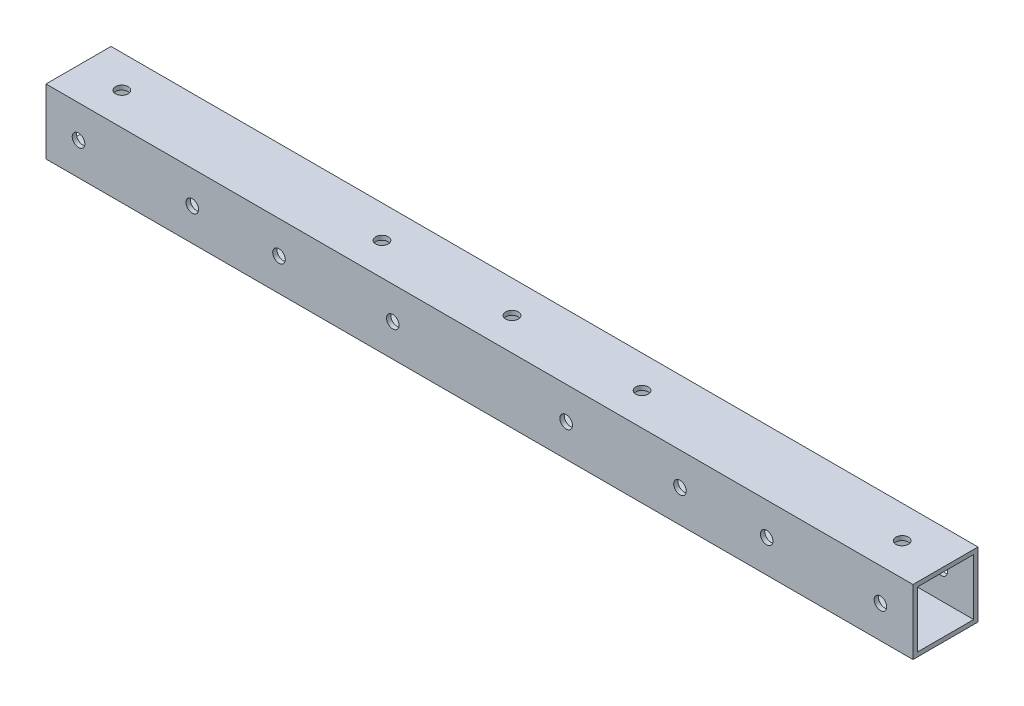
ISO-10303-21;
HEADER;
FILE_DESCRIPTION(('STEP AP214'),'2;1');
FILE_NAME('part.step','',(''),(''),'','','');
FILE_SCHEMA(('AUTOMOTIVE_DESIGN { 1 0 10303 214 1 1 1 1 }'));
ENDSEC;
DATA;
#1=APPLICATION_CONTEXT('core data for automotive mechanical design processes');
#2=APPLICATION_PROTOCOL_DEFINITION('international standard','automotive_design',2000,#1);
#3=PRODUCT_CONTEXT('',#1,'mechanical');
#4=PRODUCT('Part','Part','',(#3));
#5=PRODUCT_RELATED_PRODUCT_CATEGORY('part','',(#4));
#6=PRODUCT_DEFINITION_FORMATION('','',#4);
#7=PRODUCT_DEFINITION_CONTEXT('part definition',#1,'design');
#8=PRODUCT_DEFINITION('design','',#6,#7);
#9=PRODUCT_DEFINITION_SHAPE('','',#8);
#10=(LENGTH_UNIT() NAMED_UNIT(*) SI_UNIT(.MILLI.,.METRE.));
#11=(NAMED_UNIT(*) PLANE_ANGLE_UNIT() SI_UNIT($,.RADIAN.));
#12=(NAMED_UNIT(*) SI_UNIT($,.STERADIAN.) SOLID_ANGLE_UNIT());
#13=UNCERTAINTY_MEASURE_WITH_UNIT(LENGTH_MEASURE(1.E-05),#10,'distance_accuracy_value','');
#14=(GEOMETRIC_REPRESENTATION_CONTEXT(3) GLOBAL_UNCERTAINTY_ASSIGNED_CONTEXT((#13)) GLOBAL_UNIT_ASSIGNED_CONTEXT((#10,
#11,#12)) REPRESENTATION_CONTEXT('',''));
#15=CARTESIAN_POINT('',(0.,0.,0.));
#16=DIRECTION('',(0.,0.,1.));
#17=DIRECTION('',(1.,0.,0.));
#18=AXIS2_PLACEMENT_3D('',#15,#16,#17);
#19=CARTESIAN_POINT('',(200.,-6.50000000000001,-6.49999999999999));
#20=DIRECTION('',(0.,0.,1.));
#21=DIRECTION('',(1.,0.,0.));
#22=AXIS2_PLACEMENT_3D('',#19,#20,#21);
#23=PLANE('',#22);
#24=CARTESIAN_POINT('',(80.,0.,-6.49999999999999));
#25=DIRECTION('',(0.,0.,1.));
#26=DIRECTION('',(1.,0.,0.));
#27=AXIS2_PLACEMENT_3D('',#24,#25,#26);
#28=CIRCLE('',#27,1.45);
#29=CARTESIAN_POINT('',(81.45,0.,-6.49999999999999));
#30=VERTEX_POINT('',#29);
#31=EDGE_CURVE('E244',#30,#30,#28,.T.);
#32=ORIENTED_EDGE('',*,*,#31,.F.);
#33=EDGE_LOOP('',(#32));
#34=FACE_BOUND('',#33,.T.);
#35=CARTESIAN_POINT('',(120.,0.,-6.49999999999999));
#36=DIRECTION('',(0.,0.,1.));
#37=DIRECTION('',(1.,0.,0.));
#38=AXIS2_PLACEMENT_3D('',#35,#36,#37);
#39=CIRCLE('',#38,1.45);
#40=CARTESIAN_POINT('',(121.45,0.,-6.49999999999999));
#41=VERTEX_POINT('',#40);
#42=EDGE_CURVE('E238',#41,#41,#39,.T.);
#43=ORIENTED_EDGE('',*,*,#42,.F.);
#44=EDGE_LOOP('',(#43));
#45=FACE_BOUND('',#44,.T.);
#46=CARTESIAN_POINT('',(7.5,0.,-6.49999999999999));
#47=DIRECTION('',(0.,0.,1.));
#48=DIRECTION('',(1.,0.,0.));
#49=AXIS2_PLACEMENT_3D('',#46,#47,#48);
#50=CIRCLE('',#49,1.45);
#51=CARTESIAN_POINT('',(8.95,0.,-6.49999999999999));
#52=VERTEX_POINT('',#51);
#53=EDGE_CURVE('E316',#52,#52,#50,.T.);
#54=ORIENTED_EDGE('',*,*,#53,.F.);
#55=EDGE_LOOP('',(#54));
#56=FACE_BOUND('',#55,.T.);
#57=CARTESIAN_POINT('',(33.75,0.,-6.49999999999999));
#58=DIRECTION('',(0.,0.,1.));
#59=DIRECTION('',(1.,0.,0.));
#60=AXIS2_PLACEMENT_3D('',#57,#58,#59);
#61=CIRCLE('',#60,1.45);
#62=CARTESIAN_POINT('',(35.2,0.,-6.49999999999999));
#63=VERTEX_POINT('',#62);
#64=EDGE_CURVE('E310',#63,#63,#61,.T.);
#65=ORIENTED_EDGE('',*,*,#64,.F.);
#66=EDGE_LOOP('',(#65));
#67=FACE_BOUND('',#66,.T.);
#68=CARTESIAN_POINT('',(53.75,0.,-6.49999999999999));
#69=DIRECTION('',(0.,0.,1.));
#70=DIRECTION('',(1.,0.,0.));
#71=AXIS2_PLACEMENT_3D('',#68,#69,#70);
#72=CIRCLE('',#71,1.45);
#73=CARTESIAN_POINT('',(55.2,0.,-6.49999999999999));
#74=VERTEX_POINT('',#73);
#75=EDGE_CURVE('E304',#74,#74,#72,.T.);
#76=ORIENTED_EDGE('',*,*,#75,.F.);
#77=EDGE_LOOP('',(#76));
#78=FACE_BOUND('',#77,.T.);
#79=CARTESIAN_POINT('',(146.25,0.,-6.49999999999999));
#80=DIRECTION('',(0.,0.,1.));
#81=DIRECTION('',(1.,0.,0.));
#82=AXIS2_PLACEMENT_3D('',#79,#80,#81);
#83=CIRCLE('',#82,1.45);
#84=CARTESIAN_POINT('',(147.7,0.,-6.49999999999999));
#85=VERTEX_POINT('',#84);
#86=EDGE_CURVE('E298',#85,#85,#83,.T.);
#87=ORIENTED_EDGE('',*,*,#86,.F.);
#88=EDGE_LOOP('',(#87));
#89=FACE_BOUND('',#88,.T.);
#90=CARTESIAN_POINT('',(166.25,0.,-6.49999999999999));
#91=DIRECTION('',(0.,0.,1.));
#92=DIRECTION('',(1.,0.,0.));
#93=AXIS2_PLACEMENT_3D('',#90,#91,#92);
#94=CIRCLE('',#93,1.45);
#95=CARTESIAN_POINT('',(167.7,0.,-6.49999999999999));
#96=VERTEX_POINT('',#95);
#97=EDGE_CURVE('E292',#96,#96,#94,.T.);
#98=ORIENTED_EDGE('',*,*,#97,.F.);
#99=EDGE_LOOP('',(#98));
#100=FACE_BOUND('',#99,.T.);
#101=CARTESIAN_POINT('',(192.5,0.,-6.49999999999999));
#102=DIRECTION('',(0.,0.,1.));
#103=DIRECTION('',(1.,0.,0.));
#104=AXIS2_PLACEMENT_3D('',#101,#102,#103);
#105=CIRCLE('',#104,1.45);
#106=CARTESIAN_POINT('',(193.95,0.,-6.49999999999999));
#107=VERTEX_POINT('',#106);
#108=EDGE_CURVE('E286',#107,#107,#105,.T.);
#109=ORIENTED_EDGE('',*,*,#108,.F.);
#110=EDGE_LOOP('',(#109));
#111=FACE_BOUND('',#110,.T.);
#112=DIRECTION('',(0.,1.,0.));
#113=VECTOR('',#112,1.);
#114=CARTESIAN_POINT('',(0.,-6.50000000000001,-6.49999999999999));
#115=LINE('',#114,#113);
#116=CARTESIAN_POINT('',(0.,-6.50000000000001,-6.49999999999999));
#117=VERTEX_POINT('',#116);
#118=CARTESIAN_POINT('',(0.,6.49999999999999,-6.49999999999999));
#119=VERTEX_POINT('',#118);
#120=EDGE_CURVE('E166',#117,#119,#115,.T.);
#121=ORIENTED_EDGE('',*,*,#120,.F.);
#122=DIRECTION('',(-1.,0.,0.));
#123=VECTOR('',#122,1.);
#124=CARTESIAN_POINT('',(200.,-6.50000000000001,-6.49999999999999));
#125=LINE('',#124,#123);
#126=CARTESIAN_POINT('',(200.,-6.50000000000001,-6.49999999999999));
#127=VERTEX_POINT('',#126);
#128=EDGE_CURVE('E12',#127,#117,#125,.T.);
#129=ORIENTED_EDGE('',*,*,#128,.F.);
#130=DIRECTION('',(0.,1.,0.));
#131=VECTOR('',#130,1.);
#132=CARTESIAN_POINT('',(200.,-6.50000000000001,-6.49999999999999));
#133=LINE('',#132,#131);
#134=CARTESIAN_POINT('',(200.,6.49999999999999,-6.49999999999999));
#135=VERTEX_POINT('',#134);
#136=EDGE_CURVE('E147',#127,#135,#133,.T.);
#137=ORIENTED_EDGE('',*,*,#136,.T.);
#138=DIRECTION('',(-1.,0.,0.));
#139=VECTOR('',#138,1.);
#140=CARTESIAN_POINT('',(200.,6.49999999999999,-6.49999999999999));
#141=LINE('',#140,#139);
#142=EDGE_CURVE('E78',#135,#119,#141,.T.);
#143=ORIENTED_EDGE('',*,*,#142,.T.);
#144=EDGE_LOOP('',(#121,#129,#137,#143));
#145=FACE_BOUND('',#144,.T.);
#146=ADVANCED_FACE('F59',(#34,#45,#56,#67,#78,#89,#100,#111,#145),#23,.T.);
#147=CARTESIAN_POINT('',(200.,-6.50000000000001,6.50000000000001));
#148=DIRECTION('',(0.,1.,0.));
#149=DIRECTION('',(0.,0.,1.));
#150=AXIS2_PLACEMENT_3D('',#147,#148,#149);
#151=PLANE('',#150);
#152=CARTESIAN_POINT('',(70.,-6.50000000000001,0.));
#153=DIRECTION('',(0.,1.,0.));
#154=DIRECTION('',(0.,0.,1.));
#155=AXIS2_PLACEMENT_3D('',#152,#153,#154);
#156=CIRCLE('',#155,1.45);
#157=CARTESIAN_POINT('',(70.,-6.50000000000001,1.45));
#158=VERTEX_POINT('',#157);
#159=EDGE_CURVE('E220',#158,#158,#156,.T.);
#160=ORIENTED_EDGE('',*,*,#159,.F.);
#161=EDGE_LOOP('',(#160));
#162=FACE_BOUND('',#161,.T.);
#163=CARTESIAN_POINT('',(130.,-6.50000000000001,0.));
#164=DIRECTION('',(0.,1.,0.));
#165=DIRECTION('',(0.,0.,1.));
#166=AXIS2_PLACEMENT_3D('',#163,#164,#165);
#167=CIRCLE('',#166,1.45);
#168=CARTESIAN_POINT('',(130.,-6.50000000000001,1.45));
#169=VERTEX_POINT('',#168);
#170=EDGE_CURVE('E200',#169,#169,#167,.T.);
#171=ORIENTED_EDGE('',*,*,#170,.F.);
#172=EDGE_LOOP('',(#171));
#173=FACE_BOUND('',#172,.T.);
#174=CARTESIAN_POINT('',(10.,-6.50000000000001,0.));
#175=DIRECTION('',(0.,1.,0.));
#176=DIRECTION('',(0.,0.,1.));
#177=AXIS2_PLACEMENT_3D('',#174,#175,#176);
#178=CIRCLE('',#177,1.45);
#179=CARTESIAN_POINT('',(10.,-6.50000000000001,1.45));
#180=VERTEX_POINT('',#179);
#181=EDGE_CURVE('E160',#180,#180,#178,.F.);
#182=ORIENTED_EDGE('',*,*,#181,.T.);
#183=EDGE_LOOP('',(#182));
#184=FACE_BOUND('',#183,.T.);
#185=CARTESIAN_POINT('',(190.,-6.50000000000001,0.));
#186=DIRECTION('',(0.,1.,0.));
#187=DIRECTION('',(0.,0.,1.));
#188=AXIS2_PLACEMENT_3D('',#185,#186,#187);
#189=CIRCLE('',#188,1.45);
#190=CARTESIAN_POINT('',(190.,-6.50000000000001,1.45000000000004));
#191=VERTEX_POINT('',#190);
#192=EDGE_CURVE('E195',#191,#191,#189,.F.);
#193=ORIENTED_EDGE('',*,*,#192,.T.);
#194=EDGE_LOOP('',(#193));
#195=FACE_BOUND('',#194,.T.);
#196=CARTESIAN_POINT('',(100.,-6.50000000000001,0.));
#197=DIRECTION('',(0.,1.,0.));
#198=DIRECTION('',(0.,0.,1.));
#199=AXIS2_PLACEMENT_3D('',#196,#197,#198);
#200=CIRCLE('',#199,1.45);
#201=CARTESIAN_POINT('',(100.,-6.50000000000001,1.45000000000002));
#202=VERTEX_POINT('',#201);
#203=EDGE_CURVE('E190',#202,#202,#200,.F.);
#204=ORIENTED_EDGE('',*,*,#203,.T.);
#205=EDGE_LOOP('',(#204));
#206=FACE_BOUND('',#205,.T.);
#207=DIRECTION('',(0.,0.,-1.));
#208=VECTOR('',#207,1.);
#209=CARTESIAN_POINT('',(0.,-6.50000000000001,6.50000000000001));
#210=LINE('',#209,#208);
#211=CARTESIAN_POINT('',(0.,-6.50000000000001,6.50000000000001));
#212=VERTEX_POINT('',#211);
#213=EDGE_CURVE('E136',#212,#117,#210,.T.);
#214=ORIENTED_EDGE('',*,*,#213,.F.);
#215=DIRECTION('',(-1.,0.,0.));
#216=VECTOR('',#215,1.);
#217=CARTESIAN_POINT('',(200.,-6.50000000000001,6.50000000000001));
#218=LINE('',#217,#216);
#219=CARTESIAN_POINT('',(200.,-6.50000000000001,6.50000000000001));
#220=VERTEX_POINT('',#219);
#221=EDGE_CURVE('E69',#220,#212,#218,.T.);
#222=ORIENTED_EDGE('',*,*,#221,.F.);
#223=DIRECTION('',(0.,0.,-1.));
#224=VECTOR('',#223,1.);
#225=CARTESIAN_POINT('',(200.,-6.50000000000001,6.50000000000001));
#226=LINE('',#225,#224);
#227=EDGE_CURVE('E134',#220,#127,#226,.T.);
#228=ORIENTED_EDGE('',*,*,#227,.T.);
#229=ORIENTED_EDGE('',*,*,#128,.T.);
#230=EDGE_LOOP('',(#214,#222,#228,#229));
#231=FACE_BOUND('',#230,.T.);
#232=ADVANCED_FACE('F133',(#162,#173,#184,#195,#206,#231),#151,.T.);
#233=CARTESIAN_POINT('',(200.,-6.50000000000001,6.50000000000001));
#234=DIRECTION('',(0.,0.,-1.));
#235=DIRECTION('',(-1.,0.,0.));
#236=AXIS2_PLACEMENT_3D('',#233,#234,#235);
#237=PLANE('',#236);
#238=CARTESIAN_POINT('',(80.,0.,6.50000000000001));
#239=DIRECTION('',(0.,0.,-1.));
#240=DIRECTION('',(-1.,0.,0.));
#241=AXIS2_PLACEMENT_3D('',#238,#239,#240);
#242=CIRCLE('',#241,1.45);
#243=CARTESIAN_POINT('',(78.55,0.,6.50000000000001));
#244=VERTEX_POINT('',#243);
#245=EDGE_CURVE('E241',#244,#244,#242,.T.);
#246=ORIENTED_EDGE('',*,*,#245,.F.);
#247=EDGE_LOOP('',(#246));
#248=FACE_BOUND('',#247,.T.);
#249=CARTESIAN_POINT('',(120.,0.,6.50000000000001));
#250=DIRECTION('',(0.,0.,-1.));
#251=DIRECTION('',(-1.,0.,0.));
#252=AXIS2_PLACEMENT_3D('',#249,#250,#251);
#253=CIRCLE('',#252,1.45);
#254=CARTESIAN_POINT('',(118.55,0.,6.50000000000001));
#255=VERTEX_POINT('',#254);
#256=EDGE_CURVE('E227',#255,#255,#253,.T.);
#257=ORIENTED_EDGE('',*,*,#256,.F.);
#258=EDGE_LOOP('',(#257));
#259=FACE_BOUND('',#258,.T.);
#260=CARTESIAN_POINT('',(7.5,0.,6.50000000000001));
#261=DIRECTION('',(0.,0.,-1.));
#262=DIRECTION('',(-1.,0.,0.));
#263=AXIS2_PLACEMENT_3D('',#260,#261,#262);
#264=CIRCLE('',#263,1.45);
#265=CARTESIAN_POINT('',(6.05,0.,6.50000000000001));
#266=VERTEX_POINT('',#265);
#267=EDGE_CURVE('E313',#266,#266,#264,.T.);
#268=ORIENTED_EDGE('',*,*,#267,.F.);
#269=EDGE_LOOP('',(#268));
#270=FACE_BOUND('',#269,.T.);
#271=CARTESIAN_POINT('',(33.75,0.,6.50000000000001));
#272=DIRECTION('',(0.,0.,-1.));
#273=DIRECTION('',(-1.,0.,0.));
#274=AXIS2_PLACEMENT_3D('',#271,#272,#273);
#275=CIRCLE('',#274,1.45);
#276=CARTESIAN_POINT('',(32.3,0.,6.50000000000001));
#277=VERTEX_POINT('',#276);
#278=EDGE_CURVE('E307',#277,#277,#275,.T.);
#279=ORIENTED_EDGE('',*,*,#278,.F.);
#280=EDGE_LOOP('',(#279));
#281=FACE_BOUND('',#280,.T.);
#282=CARTESIAN_POINT('',(53.75,0.,6.50000000000001));
#283=DIRECTION('',(0.,0.,-1.));
#284=DIRECTION('',(-1.,0.,0.));
#285=AXIS2_PLACEMENT_3D('',#282,#283,#284);
#286=CIRCLE('',#285,1.45);
#287=CARTESIAN_POINT('',(52.3,0.,6.50000000000001));
#288=VERTEX_POINT('',#287);
#289=EDGE_CURVE('E301',#288,#288,#286,.T.);
#290=ORIENTED_EDGE('',*,*,#289,.F.);
#291=EDGE_LOOP('',(#290));
#292=FACE_BOUND('',#291,.T.);
#293=CARTESIAN_POINT('',(146.25,0.,6.50000000000001));
#294=DIRECTION('',(0.,0.,-1.));
#295=DIRECTION('',(-1.,0.,0.));
#296=AXIS2_PLACEMENT_3D('',#293,#294,#295);
#297=CIRCLE('',#296,1.45);
#298=CARTESIAN_POINT('',(144.8,0.,6.50000000000001));
#299=VERTEX_POINT('',#298);
#300=EDGE_CURVE('E295',#299,#299,#297,.T.);
#301=ORIENTED_EDGE('',*,*,#300,.F.);
#302=EDGE_LOOP('',(#301));
#303=FACE_BOUND('',#302,.T.);
#304=CARTESIAN_POINT('',(166.25,0.,6.50000000000001));
#305=DIRECTION('',(0.,0.,-1.));
#306=DIRECTION('',(-1.,0.,0.));
#307=AXIS2_PLACEMENT_3D('',#304,#305,#306);
#308=CIRCLE('',#307,1.45);
#309=CARTESIAN_POINT('',(164.8,0.,6.50000000000001));
#310=VERTEX_POINT('',#309);
#311=EDGE_CURVE('E289',#310,#310,#308,.T.);
#312=ORIENTED_EDGE('',*,*,#311,.F.);
#313=EDGE_LOOP('',(#312));
#314=FACE_BOUND('',#313,.T.);
#315=CARTESIAN_POINT('',(192.5,0.,6.50000000000001));
#316=DIRECTION('',(0.,0.,-1.));
#317=DIRECTION('',(-1.,0.,0.));
#318=AXIS2_PLACEMENT_3D('',#315,#316,#317);
#319=CIRCLE('',#318,1.45);
#320=CARTESIAN_POINT('',(191.05,0.,6.50000000000001));
#321=VERTEX_POINT('',#320);
#322=EDGE_CURVE('E251',#321,#321,#319,.T.);
#323=ORIENTED_EDGE('',*,*,#322,.F.);
#324=EDGE_LOOP('',(#323));
#325=FACE_BOUND('',#324,.T.);
#326=DIRECTION('',(0.,-1.,0.));
#327=VECTOR('',#326,1.);
#328=CARTESIAN_POINT('',(0.,-6.50000000000001,6.50000000000001));
#329=LINE('',#328,#327);
#330=CARTESIAN_POINT('',(0.,6.49999999999999,6.50000000000001));
#331=VERTEX_POINT('',#330);
#332=EDGE_CURVE('E169',#331,#212,#329,.T.);
#333=ORIENTED_EDGE('',*,*,#332,.F.);
#334=DIRECTION('',(-1.,0.,0.));
#335=VECTOR('',#334,1.);
#336=CARTESIAN_POINT('',(200.,6.49999999999999,6.50000000000001));
#337=LINE('',#336,#335);
#338=CARTESIAN_POINT('',(200.,6.49999999999999,6.50000000000001));
#339=VERTEX_POINT('',#338);
#340=EDGE_CURVE('E103',#339,#331,#337,.T.);
#341=ORIENTED_EDGE('',*,*,#340,.F.);
#342=DIRECTION('',(0.,-1.,0.));
#343=VECTOR('',#342,1.);
#344=CARTESIAN_POINT('',(200.,-6.50000000000001,6.50000000000001));
#345=LINE('',#344,#343);
#346=EDGE_CURVE('E146',#339,#220,#345,.T.);
#347=ORIENTED_EDGE('',*,*,#346,.T.);
#348=ORIENTED_EDGE('',*,*,#221,.T.);
#349=EDGE_LOOP('',(#333,#341,#347,#348));
#350=FACE_BOUND('',#349,.T.);
#351=ADVANCED_FACE('F149',(#248,#259,#270,#281,#292,#303,#314,#325,#350),#237,.T.);
#352=CARTESIAN_POINT('',(200.,-7.50000000000001,-7.49999999999999));
#353=DIRECTION('',(0.,0.,1.));
#354=DIRECTION('',(1.,0.,0.));
#355=AXIS2_PLACEMENT_3D('',#352,#353,#354);
#356=PLANE('',#355);
#357=CARTESIAN_POINT('',(80.,0.,-7.49999999999999));
#358=DIRECTION('',(0.,0.,1.));
#359=DIRECTION('',(1.,0.,0.));
#360=AXIS2_PLACEMENT_3D('',#357,#358,#359);
#361=CIRCLE('',#360,1.45);
#362=CARTESIAN_POINT('',(81.45,0.,-7.49999999999999));
#363=VERTEX_POINT('',#362);
#364=EDGE_CURVE('E224',#363,#363,#361,.T.);
#365=ORIENTED_EDGE('',*,*,#364,.T.);
#366=EDGE_LOOP('',(#365));
#367=FACE_BOUND('',#366,.T.);
#368=CARTESIAN_POINT('',(120.,0.,-7.49999999999999));
#369=DIRECTION('',(0.,0.,1.));
#370=DIRECTION('',(1.,0.,0.));
#371=AXIS2_PLACEMENT_3D('',#368,#369,#370);
#372=CIRCLE('',#371,1.45);
#373=CARTESIAN_POINT('',(121.45,0.,-7.49999999999999));
#374=VERTEX_POINT('',#373);
#375=EDGE_CURVE('E223',#374,#374,#372,.T.);
#376=ORIENTED_EDGE('',*,*,#375,.T.);
#377=EDGE_LOOP('',(#376));
#378=FACE_BOUND('',#377,.T.);
#379=CARTESIAN_POINT('',(7.5,0.,-7.49999999999999));
#380=DIRECTION('',(0.,0.,1.));
#381=DIRECTION('',(1.,0.,0.));
#382=AXIS2_PLACEMENT_3D('',#379,#380,#381);
#383=CIRCLE('',#382,1.45);
#384=CARTESIAN_POINT('',(8.95,0.,-7.49999999999999));
#385=VERTEX_POINT('',#384);
#386=EDGE_CURVE('E248',#385,#385,#383,.T.);
#387=ORIENTED_EDGE('',*,*,#386,.T.);
#388=EDGE_LOOP('',(#387));
#389=FACE_BOUND('',#388,.T.);
#390=CARTESIAN_POINT('',(33.75,0.,-7.49999999999999));
#391=DIRECTION('',(0.,0.,1.));
#392=DIRECTION('',(1.,0.,0.));
#393=AXIS2_PLACEMENT_3D('',#390,#391,#392);
#394=CIRCLE('',#393,1.45);
#395=CARTESIAN_POINT('',(35.2,0.,-7.49999999999999));
#396=VERTEX_POINT('',#395);
#397=EDGE_CURVE('E258',#396,#396,#394,.T.);
#398=ORIENTED_EDGE('',*,*,#397,.T.);
#399=EDGE_LOOP('',(#398));
#400=FACE_BOUND('',#399,.T.);
#401=CARTESIAN_POINT('',(53.75,0.,-7.49999999999999));
#402=DIRECTION('',(0.,0.,1.));
#403=DIRECTION('',(1.,0.,0.));
#404=AXIS2_PLACEMENT_3D('',#401,#402,#403);
#405=CIRCLE('',#404,1.45);
#406=CARTESIAN_POINT('',(55.2,0.,-7.49999999999999));
#407=VERTEX_POINT('',#406);
#408=EDGE_CURVE('E264',#407,#407,#405,.T.);
#409=ORIENTED_EDGE('',*,*,#408,.T.);
#410=EDGE_LOOP('',(#409));
#411=FACE_BOUND('',#410,.T.);
#412=CARTESIAN_POINT('',(146.25,0.,-7.49999999999999));
#413=DIRECTION('',(0.,0.,1.));
#414=DIRECTION('',(-1.,0.,0.));
#415=AXIS2_PLACEMENT_3D('',#412,#413,#414);
#416=CIRCLE('',#415,1.45);
#417=CARTESIAN_POINT('',(144.8,0.,-7.49999999999999));
#418=VERTEX_POINT('',#417);
#419=EDGE_CURVE('E270',#418,#418,#416,.T.);
#420=ORIENTED_EDGE('',*,*,#419,.T.);
#421=EDGE_LOOP('',(#420));
#422=FACE_BOUND('',#421,.T.);
#423=CARTESIAN_POINT('',(166.25,0.,-7.49999999999999));
#424=DIRECTION('',(0.,0.,1.));
#425=DIRECTION('',(-1.,0.,0.));
#426=AXIS2_PLACEMENT_3D('',#423,#424,#425);
#427=CIRCLE('',#426,1.45);
#428=CARTESIAN_POINT('',(164.8,0.,-7.49999999999999));
#429=VERTEX_POINT('',#428);
#430=EDGE_CURVE('E276',#429,#429,#427,.T.);
#431=ORIENTED_EDGE('',*,*,#430,.T.);
#432=EDGE_LOOP('',(#431));
#433=FACE_BOUND('',#432,.T.);
#434=CARTESIAN_POINT('',(192.5,0.,-7.49999999999999));
#435=DIRECTION('',(0.,0.,1.));
#436=DIRECTION('',(-1.,0.,0.));
#437=AXIS2_PLACEMENT_3D('',#434,#435,#436);
#438=CIRCLE('',#437,1.45);
#439=CARTESIAN_POINT('',(191.05,0.,-7.49999999999999));
#440=VERTEX_POINT('',#439);
#441=EDGE_CURVE('E247',#440,#440,#438,.T.);
#442=ORIENTED_EDGE('',*,*,#441,.T.);
#443=EDGE_LOOP('',(#442));
#444=FACE_BOUND('',#443,.T.);
#445=DIRECTION('',(0.,1.,0.));
#446=VECTOR('',#445,1.);
#447=CARTESIAN_POINT('',(0.,-7.50000000000001,-7.49999999999999));
#448=LINE('',#447,#446);
#449=CARTESIAN_POINT('',(0.,-7.50000000000001,-7.49999999999999));
#450=VERTEX_POINT('',#449);
#451=CARTESIAN_POINT('',(0.,7.49999999999999,-7.49999999999999));
#452=VERTEX_POINT('',#451);
#453=EDGE_CURVE('E156',#450,#452,#448,.T.);
#454=ORIENTED_EDGE('',*,*,#453,.T.);
#455=DIRECTION('',(-1.,0.,0.));
#456=VECTOR('',#455,1.);
#457=CARTESIAN_POINT('',(200.,7.49999999999999,-7.49999999999999));
#458=LINE('',#457,#456);
#459=CARTESIAN_POINT('',(200.,7.49999999999999,-7.49999999999999));
#460=VERTEX_POINT('',#459);
#461=EDGE_CURVE('E176',#460,#452,#458,.T.);
#462=ORIENTED_EDGE('',*,*,#461,.F.);
#463=DIRECTION('',(0.,1.,0.));
#464=VECTOR('',#463,1.);
#465=CARTESIAN_POINT('',(200.,-7.50000000000001,-7.49999999999999));
#466=LINE('',#465,#464);
#467=CARTESIAN_POINT('',(200.,-7.50000000000001,-7.49999999999999));
#468=VERTEX_POINT('',#467);
#469=EDGE_CURVE('E174',#468,#460,#466,.T.);
#470=ORIENTED_EDGE('',*,*,#469,.F.);
#471=DIRECTION('',(-1.,0.,0.));
#472=VECTOR('',#471,1.);
#473=CARTESIAN_POINT('',(200.,-7.50000000000001,-7.49999999999999));
#474=LINE('',#473,#472);
#475=EDGE_CURVE('E152',#468,#450,#474,.T.);
#476=ORIENTED_EDGE('',*,*,#475,.T.);
#477=EDGE_LOOP('',(#454,#462,#470,#476));
#478=FACE_BOUND('',#477,.T.);
#479=ADVANCED_FACE('F61',(#367,#378,#389,#400,#411,#422,#433,#444,#478),#356,.F.);
#480=CARTESIAN_POINT('',(200.,7.49999999999999,7.50000000000001));
#481=DIRECTION('',(0.,-1.,0.));
#482=DIRECTION('',(0.,0.,-1.));
#483=AXIS2_PLACEMENT_3D('',#480,#481,#482);
#484=PLANE('',#483);
#485=CARTESIAN_POINT('',(70.,7.49999999999999,0.));
#486=DIRECTION('',(0.,1.,0.));
#487=DIRECTION('',(0.,0.,1.));
#488=AXIS2_PLACEMENT_3D('',#485,#486,#487);
#489=CIRCLE('',#488,1.45);
#490=CARTESIAN_POINT('',(70.,7.49999999999999,1.45));
#491=VERTEX_POINT('',#490);
#492=EDGE_CURVE('E207',#491,#491,#489,.T.);
#493=ORIENTED_EDGE('',*,*,#492,.F.);
#494=EDGE_LOOP('',(#493));
#495=FACE_BOUND('',#494,.T.);
#496=CARTESIAN_POINT('',(130.,7.49999999999999,0.));
#497=DIRECTION('',(0.,1.,0.));
#498=DIRECTION('',(0.,0.,1.));
#499=AXIS2_PLACEMENT_3D('',#496,#497,#498);
#500=CIRCLE('',#499,1.45);
#501=CARTESIAN_POINT('',(130.,7.49999999999999,1.45));
#502=VERTEX_POINT('',#501);
#503=EDGE_CURVE('E212',#502,#502,#500,.T.);
#504=ORIENTED_EDGE('',*,*,#503,.F.);
#505=EDGE_LOOP('',(#504));
#506=FACE_BOUND('',#505,.T.);
#507=CARTESIAN_POINT('',(10.,7.49999999999999,0.));
#508=DIRECTION('',(0.,-1.,0.));
#509=DIRECTION('',(0.,0.,-1.));
#510=AXIS2_PLACEMENT_3D('',#507,#508,#509);
#511=CIRCLE('',#510,1.45);
#512=CARTESIAN_POINT('',(10.,7.49999999999999,-1.45));
#513=VERTEX_POINT('',#512);
#514=EDGE_CURVE('E327',#513,#513,#511,.T.);
#515=ORIENTED_EDGE('',*,*,#514,.T.);
#516=EDGE_LOOP('',(#515));
#517=FACE_BOUND('',#516,.T.);
#518=CARTESIAN_POINT('',(190.,7.49999999999999,0.));
#519=DIRECTION('',(0.,-1.,0.));
#520=DIRECTION('',(0.,0.,-1.));
#521=AXIS2_PLACEMENT_3D('',#518,#519,#520);
#522=CIRCLE('',#521,1.45);
#523=CARTESIAN_POINT('',(190.,7.49999999999999,-1.44999999999997));
#524=VERTEX_POINT('',#523);
#525=EDGE_CURVE('E320',#524,#524,#522,.T.);
#526=ORIENTED_EDGE('',*,*,#525,.T.);
#527=EDGE_LOOP('',(#526));
#528=FACE_BOUND('',#527,.T.);
#529=CARTESIAN_POINT('',(100.,7.49999999999999,0.));
#530=DIRECTION('',(0.,-1.,0.));
#531=DIRECTION('',(0.,0.,-1.));
#532=AXIS2_PLACEMENT_3D('',#529,#530,#531);
#533=CIRCLE('',#532,1.45);
#534=CARTESIAN_POINT('',(100.,7.49999999999999,-1.44999999999998));
#535=VERTEX_POINT('',#534);
#536=EDGE_CURVE('E323',#535,#535,#533,.T.);
#537=ORIENTED_EDGE('',*,*,#536,.T.);
#538=EDGE_LOOP('',(#537));
#539=FACE_BOUND('',#538,.T.);
#540=DIRECTION('',(0.,0.,1.));
#541=VECTOR('',#540,1.);
#542=CARTESIAN_POINT('',(0.,7.49999999999999,7.50000000000001));
#543=LINE('',#542,#541);
#544=CARTESIAN_POINT('',(0.,7.49999999999999,7.50000000000001));
#545=VERTEX_POINT('',#544);
#546=EDGE_CURVE('E159',#452,#545,#543,.T.);
#547=ORIENTED_EDGE('',*,*,#546,.T.);
#548=DIRECTION('',(-1.,0.,0.));
#549=VECTOR('',#548,1.);
#550=CARTESIAN_POINT('',(200.,7.49999999999999,7.50000000000001));
#551=LINE('',#550,#549);
#552=CARTESIAN_POINT('',(200.,7.49999999999999,7.50000000000001));
#553=VERTEX_POINT('',#552);
#554=EDGE_CURVE('E183',#553,#545,#551,.T.);
#555=ORIENTED_EDGE('',*,*,#554,.F.);
#556=DIRECTION('',(0.,0.,1.));
#557=VECTOR('',#556,1.);
#558=CARTESIAN_POINT('',(200.,7.49999999999999,7.50000000000001));
#559=LINE('',#558,#557);
#560=EDGE_CURVE('E116',#460,#553,#559,.T.);
#561=ORIENTED_EDGE('',*,*,#560,.F.);
#562=ORIENTED_EDGE('',*,*,#461,.T.);
#563=EDGE_LOOP('',(#547,#555,#561,#562));
#564=FACE_BOUND('',#563,.T.);
#565=ADVANCED_FACE('F380',(#495,#506,#517,#528,#539,#564),#484,.F.);
#566=CARTESIAN_POINT('',(200.,-7.50000000000001,7.49999999999999));
#567=DIRECTION('',(0.,0.,-1.));
#568=DIRECTION('',(0.,1.,0.));
#569=AXIS2_PLACEMENT_3D('',#566,#567,#568);
#570=PLANE('',#569);
#571=CARTESIAN_POINT('',(80.,0.,7.5));
#572=DIRECTION('',(0.,0.,1.));
#573=DIRECTION('',(1.,0.,0.));
#574=AXIS2_PLACEMENT_3D('',#571,#572,#573);
#575=CIRCLE('',#574,1.45);
#576=CARTESIAN_POINT('',(81.45,0.,7.5));
#577=VERTEX_POINT('',#576);
#578=EDGE_CURVE('E228',#577,#577,#575,.T.);
#579=ORIENTED_EDGE('',*,*,#578,.F.);
#580=EDGE_LOOP('',(#579));
#581=FACE_BOUND('',#580,.T.);
#582=CARTESIAN_POINT('',(120.,0.,7.5));
#583=DIRECTION('',(0.,0.,1.));
#584=DIRECTION('',(1.,0.,0.));
#585=AXIS2_PLACEMENT_3D('',#582,#583,#584);
#586=CIRCLE('',#585,1.45);
#587=CARTESIAN_POINT('',(121.45,0.,7.5));
#588=VERTEX_POINT('',#587);
#589=EDGE_CURVE('E231',#588,#588,#586,.T.);
#590=ORIENTED_EDGE('',*,*,#589,.F.);
#591=EDGE_LOOP('',(#590));
#592=FACE_BOUND('',#591,.T.);
#593=CARTESIAN_POINT('',(7.5,0.,7.5));
#594=DIRECTION('',(0.,0.,1.));
#595=DIRECTION('',(1.,0.,0.));
#596=AXIS2_PLACEMENT_3D('',#593,#594,#595);
#597=CIRCLE('',#596,1.45);
#598=CARTESIAN_POINT('',(8.95,0.,7.5));
#599=VERTEX_POINT('',#598);
#600=EDGE_CURVE('E252',#599,#599,#597,.T.);
#601=ORIENTED_EDGE('',*,*,#600,.F.);
#602=EDGE_LOOP('',(#601));
#603=FACE_BOUND('',#602,.T.);
#604=CARTESIAN_POINT('',(33.75,0.,7.5));
#605=DIRECTION('',(0.,0.,1.));
#606=DIRECTION('',(1.,0.,0.));
#607=AXIS2_PLACEMENT_3D('',#604,#605,#606);
#608=CIRCLE('',#607,1.45);
#609=CARTESIAN_POINT('',(35.2,0.,7.5));
#610=VERTEX_POINT('',#609);
#611=EDGE_CURVE('E255',#610,#610,#608,.T.);
#612=ORIENTED_EDGE('',*,*,#611,.F.);
#613=EDGE_LOOP('',(#612));
#614=FACE_BOUND('',#613,.T.);
#615=CARTESIAN_POINT('',(53.75,0.,7.5));
#616=DIRECTION('',(0.,0.,1.));
#617=DIRECTION('',(1.,0.,0.));
#618=AXIS2_PLACEMENT_3D('',#615,#616,#617);
#619=CIRCLE('',#618,1.45);
#620=CARTESIAN_POINT('',(55.2,0.,7.5));
#621=VERTEX_POINT('',#620);
#622=EDGE_CURVE('E261',#621,#621,#619,.T.);
#623=ORIENTED_EDGE('',*,*,#622,.F.);
#624=EDGE_LOOP('',(#623));
#625=FACE_BOUND('',#624,.T.);
#626=CARTESIAN_POINT('',(146.25,0.,7.5));
#627=DIRECTION('',(0.,0.,1.));
#628=DIRECTION('',(-1.,0.,0.));
#629=AXIS2_PLACEMENT_3D('',#626,#627,#628);
#630=CIRCLE('',#629,1.45);
#631=CARTESIAN_POINT('',(144.8,0.,7.5));
#632=VERTEX_POINT('',#631);
#633=EDGE_CURVE('E267',#632,#632,#630,.T.);
#634=ORIENTED_EDGE('',*,*,#633,.F.);
#635=EDGE_LOOP('',(#634));
#636=FACE_BOUND('',#635,.T.);
#637=CARTESIAN_POINT('',(166.25,0.,7.5));
#638=DIRECTION('',(0.,0.,1.));
#639=DIRECTION('',(-1.,0.,0.));
#640=AXIS2_PLACEMENT_3D('',#637,#638,#639);
#641=CIRCLE('',#640,1.45);
#642=CARTESIAN_POINT('',(164.8,0.,7.5));
#643=VERTEX_POINT('',#642);
#644=EDGE_CURVE('E273',#643,#643,#641,.T.);
#645=ORIENTED_EDGE('',*,*,#644,.F.);
#646=EDGE_LOOP('',(#645));
#647=FACE_BOUND('',#646,.T.);
#648=CARTESIAN_POINT('',(192.5,0.,7.5));
#649=DIRECTION('',(0.,0.,1.));
#650=DIRECTION('',(-1.,0.,0.));
#651=AXIS2_PLACEMENT_3D('',#648,#649,#650);
#652=CIRCLE('',#651,1.45);
#653=CARTESIAN_POINT('',(191.05,0.,7.5));
#654=VERTEX_POINT('',#653);
#655=EDGE_CURVE('E279',#654,#654,#652,.T.);
#656=ORIENTED_EDGE('',*,*,#655,.F.);
#657=EDGE_LOOP('',(#656));
#658=FACE_BOUND('',#657,.T.);
#659=DIRECTION('',(0.,-1.,0.));
#660=VECTOR('',#659,1.);
#661=CARTESIAN_POINT('',(0.,-7.50000000000001,7.49999999999999));
#662=LINE('',#661,#660);
#663=CARTESIAN_POINT('',(0.,-7.50000000000001,7.49999999999999));
#664=VERTEX_POINT('',#663);
#665=EDGE_CURVE('E162',#545,#664,#662,.T.);
#666=ORIENTED_EDGE('',*,*,#665,.T.);
#667=DIRECTION('',(-1.,0.,0.));
#668=VECTOR('',#667,1.);
#669=CARTESIAN_POINT('',(200.,-7.50000000000001,7.49999999999999));
#670=LINE('',#669,#668);
#671=CARTESIAN_POINT('',(200.,-7.50000000000001,7.49999999999999));
#672=VERTEX_POINT('',#671);
#673=EDGE_CURVE('E180',#672,#664,#670,.T.);
#674=ORIENTED_EDGE('',*,*,#673,.F.);
#675=DIRECTION('',(0.,-1.,0.));
#676=VECTOR('',#675,1.);
#677=CARTESIAN_POINT('',(200.,-7.50000000000001,7.49999999999999));
#678=LINE('',#677,#676);
#679=EDGE_CURVE('E344',#553,#672,#678,.T.);
#680=ORIENTED_EDGE('',*,*,#679,.F.);
#681=ORIENTED_EDGE('',*,*,#554,.T.);
#682=EDGE_LOOP('',(#666,#674,#680,#681));
#683=FACE_BOUND('',#682,.T.);
#684=ADVANCED_FACE('F360',(#581,#592,#603,#614,#625,#636,#647,#658,#683),#570,.F.);
#685=CARTESIAN_POINT('',(200.,-7.50000000000001,7.49999999999999));
#686=DIRECTION('',(0.,1.,0.));
#687=DIRECTION('',(0.,0.,1.));
#688=AXIS2_PLACEMENT_3D('',#685,#686,#687);
#689=PLANE('',#688);
#690=CARTESIAN_POINT('',(70.,-7.50000000000001,0.));
#691=DIRECTION('',(0.,1.,0.));
#692=DIRECTION('',(0.,0.,1.));
#693=AXIS2_PLACEMENT_3D('',#690,#691,#692);
#694=CIRCLE('',#693,1.45);
#695=CARTESIAN_POINT('',(70.,-7.50000000000001,1.45));
#696=VERTEX_POINT('',#695);
#697=EDGE_CURVE('E201',#696,#696,#694,.T.);
#698=ORIENTED_EDGE('',*,*,#697,.T.);
#699=EDGE_LOOP('',(#698));
#700=FACE_BOUND('',#699,.T.);
#701=CARTESIAN_POINT('',(130.,-7.50000000000001,0.));
#702=DIRECTION('',(0.,1.,0.));
#703=DIRECTION('',(0.,0.,1.));
#704=AXIS2_PLACEMENT_3D('',#701,#702,#703);
#705=CIRCLE('',#704,1.45);
#706=CARTESIAN_POINT('',(130.,-7.50000000000001,1.45));
#707=VERTEX_POINT('',#706);
#708=EDGE_CURVE('E217',#707,#707,#705,.T.);
#709=ORIENTED_EDGE('',*,*,#708,.T.);
#710=EDGE_LOOP('',(#709));
#711=FACE_BOUND('',#710,.T.);
#712=CARTESIAN_POINT('',(10.,-7.50000000000001,0.));
#713=DIRECTION('',(0.,-1.,0.));
#714=DIRECTION('',(0.,0.,-1.));
#715=AXIS2_PLACEMENT_3D('',#712,#713,#714);
#716=CIRCLE('',#715,1.45);
#717=CARTESIAN_POINT('',(10.,-7.50000000000001,-1.45));
#718=VERTEX_POINT('',#717);
#719=EDGE_CURVE('E319',#718,#718,#716,.T.);
#720=ORIENTED_EDGE('',*,*,#719,.F.);
#721=EDGE_LOOP('',(#720));
#722=FACE_BOUND('',#721,.T.);
#723=CARTESIAN_POINT('',(190.,-7.50000000000001,0.));
#724=DIRECTION('',(0.,-1.,0.));
#725=DIRECTION('',(0.,0.,-1.));
#726=AXIS2_PLACEMENT_3D('',#723,#724,#725);
#727=CIRCLE('',#726,1.45);
#728=CARTESIAN_POINT('',(190.,-7.50000000000001,-1.44999999999997));
#729=VERTEX_POINT('',#728);
#730=EDGE_CURVE('E324',#729,#729,#727,.T.);
#731=ORIENTED_EDGE('',*,*,#730,.F.);
#732=EDGE_LOOP('',(#731));
#733=FACE_BOUND('',#732,.T.);
#734=CARTESIAN_POINT('',(100.,-7.50000000000001,0.));
#735=DIRECTION('',(0.,-1.,0.));
#736=DIRECTION('',(0.,0.,-1.));
#737=AXIS2_PLACEMENT_3D('',#734,#735,#736);
#738=CIRCLE('',#737,1.45);
#739=CARTESIAN_POINT('',(100.,-7.50000000000001,-1.44999999999998));
#740=VERTEX_POINT('',#739);
#741=EDGE_CURVE('E191',#740,#740,#738,.T.);
#742=ORIENTED_EDGE('',*,*,#741,.F.);
#743=EDGE_LOOP('',(#742));
#744=FACE_BOUND('',#743,.T.);
#745=DIRECTION('',(0.,0.,-1.));
#746=VECTOR('',#745,1.);
#747=CARTESIAN_POINT('',(0.,-7.50000000000001,7.49999999999999));
#748=LINE('',#747,#746);
#749=EDGE_CURVE('E164',#664,#450,#748,.T.);
#750=ORIENTED_EDGE('',*,*,#749,.T.);
#751=ORIENTED_EDGE('',*,*,#475,.F.);
#752=DIRECTION('',(0.,0.,-1.));
#753=VECTOR('',#752,1.);
#754=CARTESIAN_POINT('',(200.,-7.50000000000001,7.49999999999999));
#755=LINE('',#754,#753);
#756=EDGE_CURVE('E346',#672,#468,#755,.T.);
#757=ORIENTED_EDGE('',*,*,#756,.F.);
#758=ORIENTED_EDGE('',*,*,#673,.T.);
#759=EDGE_LOOP('',(#750,#751,#757,#758));
#760=FACE_BOUND('',#759,.T.);
#761=ADVANCED_FACE('F349',(#700,#711,#722,#733,#744,#760),#689,.F.);
#762=CARTESIAN_POINT('',(200.,6.49999999999999,6.50000000000001));
#763=DIRECTION('',(0.,-1.,0.));
#764=DIRECTION('',(0.,0.,-1.));
#765=AXIS2_PLACEMENT_3D('',#762,#763,#764);
#766=PLANE('',#765);
#767=CARTESIAN_POINT('',(70.,6.49999999999999,0.));
#768=DIRECTION('',(0.,-1.,0.));
#769=DIRECTION('',(0.,0.,-1.));
#770=AXIS2_PLACEMENT_3D('',#767,#768,#769);
#771=CIRCLE('',#770,1.45);
#772=CARTESIAN_POINT('',(70.,6.49999999999999,-1.45));
#773=VERTEX_POINT('',#772);
#774=EDGE_CURVE('E63',#773,#773,#771,.T.);
#775=ORIENTED_EDGE('',*,*,#774,.F.);
#776=EDGE_LOOP('',(#775));
#777=FACE_BOUND('',#776,.T.);
#778=CARTESIAN_POINT('',(130.,6.49999999999999,0.));
#779=DIRECTION('',(0.,-1.,0.));
#780=DIRECTION('',(0.,0.,-1.));
#781=AXIS2_PLACEMENT_3D('',#778,#779,#780);
#782=CIRCLE('',#781,1.45);
#783=CARTESIAN_POINT('',(130.,6.49999999999999,-1.45));
#784=VERTEX_POINT('',#783);
#785=EDGE_CURVE('E198',#784,#784,#782,.T.);
#786=ORIENTED_EDGE('',*,*,#785,.F.);
#787=EDGE_LOOP('',(#786));
#788=FACE_BOUND('',#787,.T.);
#789=CARTESIAN_POINT('',(10.,6.49999999999999,0.));
#790=DIRECTION('',(0.,-1.,0.));
#791=DIRECTION('',(0.,0.,-1.));
#792=AXIS2_PLACEMENT_3D('',#789,#790,#791);
#793=CIRCLE('',#792,1.45);
#794=CARTESIAN_POINT('',(10.,6.49999999999999,-1.45));
#795=VERTEX_POINT('',#794);
#796=EDGE_CURVE('E196',#795,#795,#793,.F.);
#797=ORIENTED_EDGE('',*,*,#796,.T.);
#798=EDGE_LOOP('',(#797));
#799=FACE_BOUND('',#798,.T.);
#800=CARTESIAN_POINT('',(190.,6.49999999999999,0.));
#801=DIRECTION('',(0.,-1.,0.));
#802=DIRECTION('',(0.,0.,-1.));
#803=AXIS2_PLACEMENT_3D('',#800,#801,#802);
#804=CIRCLE('',#803,1.45);
#805=CARTESIAN_POINT('',(190.,6.49999999999999,-1.44999999999997));
#806=VERTEX_POINT('',#805);
#807=EDGE_CURVE('E192',#806,#806,#804,.F.);
#808=ORIENTED_EDGE('',*,*,#807,.T.);
#809=EDGE_LOOP('',(#808));
#810=FACE_BOUND('',#809,.T.);
#811=CARTESIAN_POINT('',(100.,6.49999999999999,0.));
#812=DIRECTION('',(0.,-1.,0.));
#813=DIRECTION('',(0.,0.,-1.));
#814=AXIS2_PLACEMENT_3D('',#811,#812,#813);
#815=CIRCLE('',#814,1.45);
#816=CARTESIAN_POINT('',(100.,6.49999999999999,-1.44999999999998));
#817=VERTEX_POINT('',#816);
#818=EDGE_CURVE('E187',#817,#817,#815,.F.);
#819=ORIENTED_EDGE('',*,*,#818,.T.);
#820=EDGE_LOOP('',(#819));
#821=FACE_BOUND('',#820,.T.);
#822=DIRECTION('',(0.,0.,1.));
#823=VECTOR('',#822,1.);
#824=CARTESIAN_POINT('',(0.,6.49999999999999,6.50000000000001));
#825=LINE('',#824,#823);
#826=EDGE_CURVE('E171',#119,#331,#825,.T.);
#827=ORIENTED_EDGE('',*,*,#826,.F.);
#828=ORIENTED_EDGE('',*,*,#142,.F.);
#829=DIRECTION('',(0.,0.,1.));
#830=VECTOR('',#829,1.);
#831=CARTESIAN_POINT('',(200.,6.49999999999999,6.50000000000001));
#832=LINE('',#831,#830);
#833=EDGE_CURVE('E150',#135,#339,#832,.T.);
#834=ORIENTED_EDGE('',*,*,#833,.T.);
#835=ORIENTED_EDGE('',*,*,#340,.T.);
#836=EDGE_LOOP('',(#827,#828,#834,#835));
#837=FACE_BOUND('',#836,.T.);
#838=ADVANCED_FACE('F347',(#777,#788,#799,#810,#821,#837),#766,.T.);
#839=CARTESIAN_POINT('',(200.,0.,0.));
#840=DIRECTION('',(-1.,0.,0.));
#841=DIRECTION('',(0.,0.,1.));
#842=AXIS2_PLACEMENT_3D('',#839,#840,#841);
#843=PLANE('',#842);
#844=ORIENTED_EDGE('',*,*,#469,.T.);
#845=ORIENTED_EDGE('',*,*,#560,.T.);
#846=ORIENTED_EDGE('',*,*,#679,.T.);
#847=ORIENTED_EDGE('',*,*,#756,.T.);
#848=EDGE_LOOP('',(#844,#845,#846,#847));
#849=FACE_BOUND('',#848,.T.);
#850=ORIENTED_EDGE('',*,*,#136,.F.);
#851=ORIENTED_EDGE('',*,*,#227,.F.);
#852=ORIENTED_EDGE('',*,*,#346,.F.);
#853=ORIENTED_EDGE('',*,*,#833,.F.);
#854=EDGE_LOOP('',(#850,#851,#852,#853));
#855=FACE_BOUND('',#854,.T.);
#856=ADVANCED_FACE('F144',(#849,#855),#843,.F.);
#857=CARTESIAN_POINT('',(0.,0.,0.));
#858=DIRECTION('',(-1.,0.,0.));
#859=DIRECTION('',(0.,0.,1.));
#860=AXIS2_PLACEMENT_3D('',#857,#858,#859);
#861=PLANE('',#860);
#862=ORIENTED_EDGE('',*,*,#453,.F.);
#863=ORIENTED_EDGE('',*,*,#749,.F.);
#864=ORIENTED_EDGE('',*,*,#665,.F.);
#865=ORIENTED_EDGE('',*,*,#546,.F.);
#866=EDGE_LOOP('',(#862,#863,#864,#865));
#867=FACE_BOUND('',#866,.T.);
#868=ORIENTED_EDGE('',*,*,#120,.T.);
#869=ORIENTED_EDGE('',*,*,#826,.T.);
#870=ORIENTED_EDGE('',*,*,#332,.T.);
#871=ORIENTED_EDGE('',*,*,#213,.T.);
#872=EDGE_LOOP('',(#868,#869,#870,#871));
#873=FACE_BOUND('',#872,.T.);
#874=ADVANCED_FACE('F357',(#867,#873),#861,.T.);
#875=CARTESIAN_POINT('',(100.,-7.50000000000001,0.));
#876=DIRECTION('',(0.,1.,0.));
#877=DIRECTION('',(0.,0.,1.));
#878=AXIS2_PLACEMENT_3D('',#875,#876,#877);
#879=CYLINDRICAL_SURFACE('',#878,1.45);
#880=ORIENTED_EDGE('',*,*,#818,.F.);
#881=EDGE_LOOP('',(#880));
#882=FACE_BOUND('',#881,.T.);
#883=ORIENTED_EDGE('',*,*,#536,.F.);
#884=EDGE_LOOP('',(#883));
#885=FACE_BOUND('',#884,.T.);
#886=ADVANCED_FACE('F412',(#882,#885),#879,.F.);
#887=CARTESIAN_POINT('',(190.,-7.50000000000001,0.));
#888=DIRECTION('',(0.,1.,0.));
#889=DIRECTION('',(0.,0.,1.));
#890=AXIS2_PLACEMENT_3D('',#887,#888,#889);
#891=CYLINDRICAL_SURFACE('',#890,1.45);
#892=ORIENTED_EDGE('',*,*,#807,.F.);
#893=EDGE_LOOP('',(#892));
#894=FACE_BOUND('',#893,.T.);
#895=ORIENTED_EDGE('',*,*,#525,.F.);
#896=EDGE_LOOP('',(#895));
#897=FACE_BOUND('',#896,.T.);
#898=ADVANCED_FACE('F416',(#894,#897),#891,.F.);
#899=CARTESIAN_POINT('',(10.,-7.50000000000001,0.));
#900=DIRECTION('',(0.,1.,0.));
#901=DIRECTION('',(0.,0.,1.));
#902=AXIS2_PLACEMENT_3D('',#899,#900,#901);
#903=CYLINDRICAL_SURFACE('',#902,1.45);
#904=ORIENTED_EDGE('',*,*,#796,.F.);
#905=EDGE_LOOP('',(#904));
#906=FACE_BOUND('',#905,.T.);
#907=ORIENTED_EDGE('',*,*,#514,.F.);
#908=EDGE_LOOP('',(#907));
#909=FACE_BOUND('',#908,.T.);
#910=ADVANCED_FACE('F421',(#906,#909),#903,.F.);
#911=ORIENTED_EDGE('',*,*,#203,.F.);
#912=EDGE_LOOP('',(#911));
#913=FACE_BOUND('',#912,.T.);
#914=ORIENTED_EDGE('',*,*,#741,.T.);
#915=EDGE_LOOP('',(#914));
#916=FACE_BOUND('',#915,.T.);
#917=ADVANCED_FACE('F419',(#913,#916),#879,.F.);
#918=ORIENTED_EDGE('',*,*,#192,.F.);
#919=EDGE_LOOP('',(#918));
#920=FACE_BOUND('',#919,.T.);
#921=ORIENTED_EDGE('',*,*,#730,.T.);
#922=EDGE_LOOP('',(#921));
#923=FACE_BOUND('',#922,.T.);
#924=ADVANCED_FACE('F429',(#920,#923),#891,.F.);
#925=ORIENTED_EDGE('',*,*,#181,.F.);
#926=EDGE_LOOP('',(#925));
#927=FACE_BOUND('',#926,.T.);
#928=ORIENTED_EDGE('',*,*,#719,.T.);
#929=EDGE_LOOP('',(#928));
#930=FACE_BOUND('',#929,.T.);
#931=ADVANCED_FACE('F425',(#927,#930),#903,.F.);
#932=CARTESIAN_POINT('',(192.5,0.,-7.49999999999999));
#933=DIRECTION('',(0.,0.,1.));
#934=DIRECTION('',(1.,0.,0.));
#935=AXIS2_PLACEMENT_3D('',#932,#933,#934);
#936=CYLINDRICAL_SURFACE('',#935,1.45);
#937=ORIENTED_EDGE('',*,*,#322,.T.);
#938=EDGE_LOOP('',(#937));
#939=FACE_BOUND('',#938,.T.);
#940=ORIENTED_EDGE('',*,*,#655,.T.);
#941=EDGE_LOOP('',(#940));
#942=FACE_BOUND('',#941,.T.);
#943=ADVANCED_FACE('F430',(#939,#942),#936,.F.);
#944=CARTESIAN_POINT('',(166.25,0.,-7.49999999999999));
#945=DIRECTION('',(0.,0.,1.));
#946=DIRECTION('',(1.,0.,0.));
#947=AXIS2_PLACEMENT_3D('',#944,#945,#946);
#948=CYLINDRICAL_SURFACE('',#947,1.45);
#949=ORIENTED_EDGE('',*,*,#311,.T.);
#950=EDGE_LOOP('',(#949));
#951=FACE_BOUND('',#950,.T.);
#952=ORIENTED_EDGE('',*,*,#644,.T.);
#953=EDGE_LOOP('',(#952));
#954=FACE_BOUND('',#953,.T.);
#955=ADVANCED_FACE('F433',(#951,#954),#948,.F.);
#956=CARTESIAN_POINT('',(146.25,0.,-7.49999999999999));
#957=DIRECTION('',(0.,0.,1.));
#958=DIRECTION('',(1.,0.,0.));
#959=AXIS2_PLACEMENT_3D('',#956,#957,#958);
#960=CYLINDRICAL_SURFACE('',#959,1.45);
#961=ORIENTED_EDGE('',*,*,#300,.T.);
#962=EDGE_LOOP('',(#961));
#963=FACE_BOUND('',#962,.T.);
#964=ORIENTED_EDGE('',*,*,#633,.T.);
#965=EDGE_LOOP('',(#964));
#966=FACE_BOUND('',#965,.T.);
#967=ADVANCED_FACE('F438',(#963,#966),#960,.F.);
#968=CARTESIAN_POINT('',(53.75,0.,-7.49999999999999));
#969=DIRECTION('',(0.,0.,1.));
#970=DIRECTION('',(1.,0.,0.));
#971=AXIS2_PLACEMENT_3D('',#968,#969,#970);
#972=CYLINDRICAL_SURFACE('',#971,1.45);
#973=ORIENTED_EDGE('',*,*,#289,.T.);
#974=EDGE_LOOP('',(#973));
#975=FACE_BOUND('',#974,.T.);
#976=ORIENTED_EDGE('',*,*,#622,.T.);
#977=EDGE_LOOP('',(#976));
#978=FACE_BOUND('',#977,.T.);
#979=ADVANCED_FACE('F443',(#975,#978),#972,.F.);
#980=CARTESIAN_POINT('',(33.75,0.,-7.49999999999999));
#981=DIRECTION('',(0.,0.,1.));
#982=DIRECTION('',(1.,0.,0.));
#983=AXIS2_PLACEMENT_3D('',#980,#981,#982);
#984=CYLINDRICAL_SURFACE('',#983,1.45);
#985=ORIENTED_EDGE('',*,*,#278,.T.);
#986=EDGE_LOOP('',(#985));
#987=FACE_BOUND('',#986,.T.);
#988=ORIENTED_EDGE('',*,*,#611,.T.);
#989=EDGE_LOOP('',(#988));
#990=FACE_BOUND('',#989,.T.);
#991=ADVANCED_FACE('F448',(#987,#990),#984,.F.);
#992=CARTESIAN_POINT('',(7.5,0.,-7.49999999999999));
#993=DIRECTION('',(0.,0.,1.));
#994=DIRECTION('',(1.,0.,0.));
#995=AXIS2_PLACEMENT_3D('',#992,#993,#994);
#996=CYLINDRICAL_SURFACE('',#995,1.45);
#997=ORIENTED_EDGE('',*,*,#267,.T.);
#998=EDGE_LOOP('',(#997));
#999=FACE_BOUND('',#998,.T.);
#1000=ORIENTED_EDGE('',*,*,#600,.T.);
#1001=EDGE_LOOP('',(#1000));
#1002=FACE_BOUND('',#1001,.T.);
#1003=ADVANCED_FACE('F453',(#999,#1002),#996,.F.);
#1004=ORIENTED_EDGE('',*,*,#108,.T.);
#1005=EDGE_LOOP('',(#1004));
#1006=FACE_BOUND('',#1005,.T.);
#1007=ORIENTED_EDGE('',*,*,#441,.F.);
#1008=EDGE_LOOP('',(#1007));
#1009=FACE_BOUND('',#1008,.T.);
#1010=ADVANCED_FACE('F435',(#1006,#1009),#936,.F.);
#1011=ORIENTED_EDGE('',*,*,#97,.T.);
#1012=EDGE_LOOP('',(#1011));
#1013=FACE_BOUND('',#1012,.T.);
#1014=ORIENTED_EDGE('',*,*,#430,.F.);
#1015=EDGE_LOOP('',(#1014));
#1016=FACE_BOUND('',#1015,.T.);
#1017=ADVANCED_FACE('F440',(#1013,#1016),#948,.F.);
#1018=ORIENTED_EDGE('',*,*,#86,.T.);
#1019=EDGE_LOOP('',(#1018));
#1020=FACE_BOUND('',#1019,.T.);
#1021=ORIENTED_EDGE('',*,*,#419,.F.);
#1022=EDGE_LOOP('',(#1021));
#1023=FACE_BOUND('',#1022,.T.);
#1024=ADVANCED_FACE('F445',(#1020,#1023),#960,.F.);
#1025=ORIENTED_EDGE('',*,*,#75,.T.);
#1026=EDGE_LOOP('',(#1025));
#1027=FACE_BOUND('',#1026,.T.);
#1028=ORIENTED_EDGE('',*,*,#408,.F.);
#1029=EDGE_LOOP('',(#1028));
#1030=FACE_BOUND('',#1029,.T.);
#1031=ADVANCED_FACE('F450',(#1027,#1030),#972,.F.);
#1032=ORIENTED_EDGE('',*,*,#64,.T.);
#1033=EDGE_LOOP('',(#1032));
#1034=FACE_BOUND('',#1033,.T.);
#1035=ORIENTED_EDGE('',*,*,#397,.F.);
#1036=EDGE_LOOP('',(#1035));
#1037=FACE_BOUND('',#1036,.T.);
#1038=ADVANCED_FACE('F455',(#1034,#1037),#984,.F.);
#1039=ORIENTED_EDGE('',*,*,#53,.T.);
#1040=EDGE_LOOP('',(#1039));
#1041=FACE_BOUND('',#1040,.T.);
#1042=ORIENTED_EDGE('',*,*,#386,.F.);
#1043=EDGE_LOOP('',(#1042));
#1044=FACE_BOUND('',#1043,.T.);
#1045=ADVANCED_FACE('F459',(#1041,#1044),#996,.F.);
#1046=CARTESIAN_POINT('',(120.,0.,-7.49999999999999));
#1047=DIRECTION('',(0.,0.,1.));
#1048=DIRECTION('',(1.,0.,0.));
#1049=AXIS2_PLACEMENT_3D('',#1046,#1047,#1048);
#1050=CYLINDRICAL_SURFACE('',#1049,1.45);
#1051=ORIENTED_EDGE('',*,*,#256,.T.);
#1052=EDGE_LOOP('',(#1051));
#1053=FACE_BOUND('',#1052,.T.);
#1054=ORIENTED_EDGE('',*,*,#589,.T.);
#1055=EDGE_LOOP('',(#1054));
#1056=FACE_BOUND('',#1055,.T.);
#1057=ADVANCED_FACE('F460',(#1053,#1056),#1050,.F.);
#1058=CARTESIAN_POINT('',(80.,0.,-7.49999999999999));
#1059=DIRECTION('',(0.,0.,1.));
#1060=DIRECTION('',(1.,0.,0.));
#1061=AXIS2_PLACEMENT_3D('',#1058,#1059,#1060);
#1062=CYLINDRICAL_SURFACE('',#1061,1.45);
#1063=ORIENTED_EDGE('',*,*,#245,.T.);
#1064=EDGE_LOOP('',(#1063));
#1065=FACE_BOUND('',#1064,.T.);
#1066=ORIENTED_EDGE('',*,*,#578,.T.);
#1067=EDGE_LOOP('',(#1066));
#1068=FACE_BOUND('',#1067,.T.);
#1069=ADVANCED_FACE('F463',(#1065,#1068),#1062,.F.);
#1070=ORIENTED_EDGE('',*,*,#42,.T.);
#1071=EDGE_LOOP('',(#1070));
#1072=FACE_BOUND('',#1071,.T.);
#1073=ORIENTED_EDGE('',*,*,#375,.F.);
#1074=EDGE_LOOP('',(#1073));
#1075=FACE_BOUND('',#1074,.T.);
#1076=ADVANCED_FACE('F465',(#1072,#1075),#1050,.F.);
#1077=ORIENTED_EDGE('',*,*,#31,.T.);
#1078=EDGE_LOOP('',(#1077));
#1079=FACE_BOUND('',#1078,.T.);
#1080=ORIENTED_EDGE('',*,*,#364,.F.);
#1081=EDGE_LOOP('',(#1080));
#1082=FACE_BOUND('',#1081,.T.);
#1083=ADVANCED_FACE('F469',(#1079,#1082),#1062,.F.);
#1084=CARTESIAN_POINT('',(130.,-7.50000000000001,0.));
#1085=DIRECTION('',(0.,1.,0.));
#1086=DIRECTION('',(0.,0.,1.));
#1087=AXIS2_PLACEMENT_3D('',#1084,#1085,#1086);
#1088=CYLINDRICAL_SURFACE('',#1087,1.45);
#1089=ORIENTED_EDGE('',*,*,#785,.T.);
#1090=EDGE_LOOP('',(#1089));
#1091=FACE_BOUND('',#1090,.T.);
#1092=ORIENTED_EDGE('',*,*,#503,.T.);
#1093=EDGE_LOOP('',(#1092));
#1094=FACE_BOUND('',#1093,.T.);
#1095=ADVANCED_FACE('F470',(#1091,#1094),#1088,.F.);
#1096=CARTESIAN_POINT('',(70.,-7.50000000000001,0.));
#1097=DIRECTION('',(0.,1.,0.));
#1098=DIRECTION('',(0.,0.,1.));
#1099=AXIS2_PLACEMENT_3D('',#1096,#1097,#1098);
#1100=CYLINDRICAL_SURFACE('',#1099,1.45);
#1101=ORIENTED_EDGE('',*,*,#774,.T.);
#1102=EDGE_LOOP('',(#1101));
#1103=FACE_BOUND('',#1102,.T.);
#1104=ORIENTED_EDGE('',*,*,#492,.T.);
#1105=EDGE_LOOP('',(#1104));
#1106=FACE_BOUND('',#1105,.T.);
#1107=ADVANCED_FACE('F472',(#1103,#1106),#1100,.F.);
#1108=ORIENTED_EDGE('',*,*,#170,.T.);
#1109=EDGE_LOOP('',(#1108));
#1110=FACE_BOUND('',#1109,.T.);
#1111=ORIENTED_EDGE('',*,*,#708,.F.);
#1112=EDGE_LOOP('',(#1111));
#1113=FACE_BOUND('',#1112,.T.);
#1114=ADVANCED_FACE('F473',(#1110,#1113),#1088,.F.);
#1115=ORIENTED_EDGE('',*,*,#159,.T.);
#1116=EDGE_LOOP('',(#1115));
#1117=FACE_BOUND('',#1116,.T.);
#1118=ORIENTED_EDGE('',*,*,#697,.F.);
#1119=EDGE_LOOP('',(#1118));
#1120=FACE_BOUND('',#1119,.T.);
#1121=ADVANCED_FACE('F476',(#1117,#1120),#1100,.F.);
#1122=CLOSED_SHELL('',(#146,#232,#351,#479,#565,#684,#761,#838,#856,#874,#886,#898,#910,#917,
#924,#931,#943,#955,#967,#979,#991,#1003,#1010,#1017,#1024,#1031,#1038,#1045,#1057,#1069,#1076,
#1083,#1095,#1107,#1114,#1121));
#1123=MANIFOLD_SOLID_BREP('B2',#1122);
#1124=ADVANCED_BREP_SHAPE_REPRESENTATION('',(#18,#1123),#14);
#1125=SHAPE_DEFINITION_REPRESENTATION(#9,#1124);
ENDSEC;
END-ISO-10303-21;
